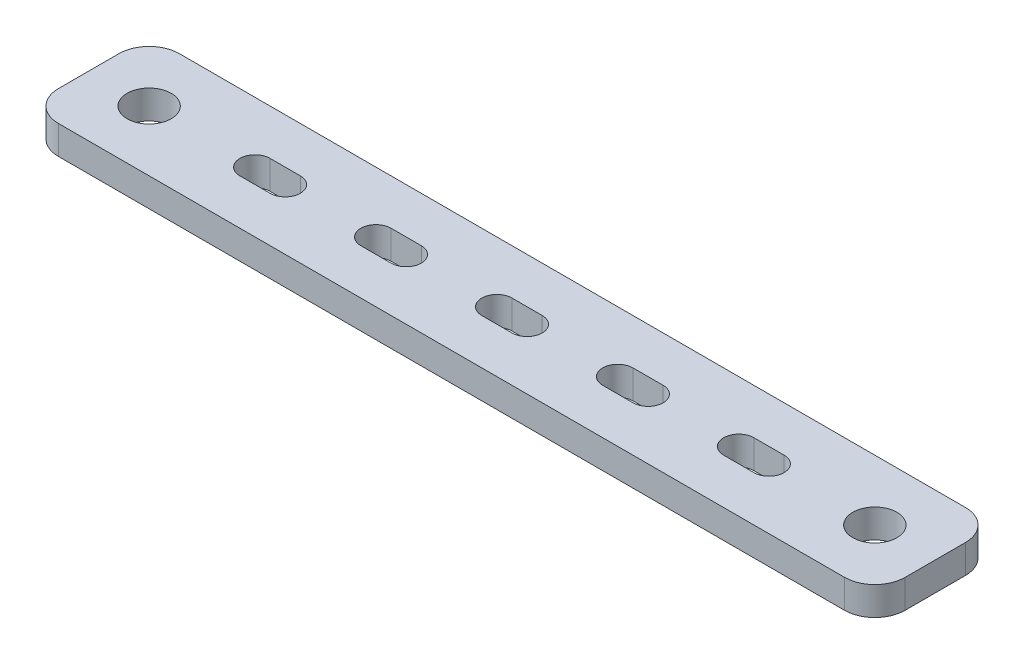
ISO-10303-21;
HEADER;
FILE_DESCRIPTION(('STEP AP214'),'2;1');
FILE_NAME('part.step','',(''),(''),'','','');
FILE_SCHEMA(('AUTOMOTIVE_DESIGN { 1 0 10303 214 1 1 1 1 }'));
ENDSEC;
DATA;
#1=APPLICATION_CONTEXT('core data for automotive mechanical design processes');
#2=APPLICATION_PROTOCOL_DEFINITION('international standard','automotive_design',2000,#1);
#3=PRODUCT_CONTEXT('',#1,'mechanical');
#4=PRODUCT('Part','Part','',(#3));
#5=PRODUCT_RELATED_PRODUCT_CATEGORY('part','',(#4));
#6=PRODUCT_DEFINITION_FORMATION('','',#4);
#7=PRODUCT_DEFINITION_CONTEXT('part definition',#1,'design');
#8=PRODUCT_DEFINITION('design','',#6,#7);
#9=PRODUCT_DEFINITION_SHAPE('','',#8);
#10=(LENGTH_UNIT() NAMED_UNIT(*) SI_UNIT(.MILLI.,.METRE.));
#11=(NAMED_UNIT(*) PLANE_ANGLE_UNIT() SI_UNIT($,.RADIAN.));
#12=(NAMED_UNIT(*) SI_UNIT($,.STERADIAN.) SOLID_ANGLE_UNIT());
#13=UNCERTAINTY_MEASURE_WITH_UNIT(LENGTH_MEASURE(1.E-05),#10,'distance_accuracy_value','');
#14=(GEOMETRIC_REPRESENTATION_CONTEXT(3) GLOBAL_UNCERTAINTY_ASSIGNED_CONTEXT((#13)) GLOBAL_UNIT_ASSIGNED_CONTEXT((#10,
#11,#12)) REPRESENTATION_CONTEXT('',''));
#15=CARTESIAN_POINT('',(0.,0.,0.));
#16=DIRECTION('',(0.,0.,1.));
#17=DIRECTION('',(1.,0.,0.));
#18=AXIS2_PLACEMENT_3D('',#15,#16,#17);
#19=CARTESIAN_POINT('',(-88.9,6.,12.7));
#20=DIRECTION('',(1.,0.,0.));
#21=DIRECTION('',(0.,0.,-1.));
#22=AXIS2_PLACEMENT_3D('',#19,#20,#21);
#23=PLANE('',#22);
#24=DIRECTION('',(0.,0.,1.));
#25=VECTOR('',#24,1.);
#26=CARTESIAN_POINT('',(-88.9,0.,12.7));
#27=LINE('',#26,#25);
#28=CARTESIAN_POINT('',(-88.9,0.,-6.34999999999999));
#29=VERTEX_POINT('',#28);
#30=CARTESIAN_POINT('',(-88.9,0.,6.35000000000001));
#31=VERTEX_POINT('',#30);
#32=EDGE_CURVE('E396',#29,#31,#27,.T.);
#33=ORIENTED_EDGE('',*,*,#32,.T.);
#34=DIRECTION('',(0.,-1.,0.));
#35=VECTOR('',#34,1.);
#36=CARTESIAN_POINT('',(-88.9,6.,6.35000000000001));
#37=LINE('',#36,#35);
#38=CARTESIAN_POINT('',(-88.9,6.,6.35000000000001));
#39=VERTEX_POINT('',#38);
#40=EDGE_CURVE('E11',#31,#39,#37,.F.);
#41=ORIENTED_EDGE('',*,*,#40,.T.);
#42=DIRECTION('',(0.,0.,1.));
#43=VECTOR('',#42,1.);
#44=CARTESIAN_POINT('',(-88.9,6.,12.7));
#45=LINE('',#44,#43);
#46=CARTESIAN_POINT('',(-88.9,6.,-6.34999999999999));
#47=VERTEX_POINT('',#46);
#48=EDGE_CURVE('E403',#47,#39,#45,.T.);
#49=ORIENTED_EDGE('',*,*,#48,.F.);
#50=DIRECTION('',(0.,-1.,0.));
#51=VECTOR('',#50,1.);
#52=CARTESIAN_POINT('',(-88.9,6.,-6.34999999999999));
#53=LINE('',#52,#51);
#54=EDGE_CURVE('E48',#47,#29,#53,.T.);
#55=ORIENTED_EDGE('',*,*,#54,.T.);
#56=EDGE_LOOP('',(#33,#41,#49,#55));
#57=FACE_BOUND('',#56,.T.);
#58=ADVANCED_FACE('F40',(#57),#23,.F.);
#59=CARTESIAN_POINT('',(88.9,6.,12.7));
#60=DIRECTION('',(0.,0.,-1.));
#61=DIRECTION('',(-1.,0.,0.));
#62=AXIS2_PLACEMENT_3D('',#59,#60,#61);
#63=PLANE('',#62);
#64=DIRECTION('',(1.,0.,0.));
#65=VECTOR('',#64,1.);
#66=CARTESIAN_POINT('',(88.9,0.,12.7));
#67=LINE('',#66,#65);
#68=CARTESIAN_POINT('',(-82.55,0.,12.7));
#69=VERTEX_POINT('',#68);
#70=CARTESIAN_POINT('',(82.55,0.,12.7));
#71=VERTEX_POINT('',#70);
#72=EDGE_CURVE('E418',#69,#71,#67,.T.);
#73=ORIENTED_EDGE('',*,*,#72,.T.);
#74=DIRECTION('',(0.,-1.,0.));
#75=VECTOR('',#74,1.);
#76=CARTESIAN_POINT('',(82.55,6.,12.7));
#77=LINE('',#76,#75);
#78=CARTESIAN_POINT('',(82.55,6.,12.7));
#79=VERTEX_POINT('',#78);
#80=EDGE_CURVE('E440',#71,#79,#77,.F.);
#81=ORIENTED_EDGE('',*,*,#80,.T.);
#82=DIRECTION('',(1.,0.,0.));
#83=VECTOR('',#82,1.);
#84=CARTESIAN_POINT('',(88.9,6.,12.7));
#85=LINE('',#84,#83);
#86=CARTESIAN_POINT('',(-82.55,6.,12.7));
#87=VERTEX_POINT('',#86);
#88=EDGE_CURVE('E406',#87,#79,#85,.T.);
#89=ORIENTED_EDGE('',*,*,#88,.F.);
#90=DIRECTION('',(0.,-1.,0.));
#91=VECTOR('',#90,1.);
#92=CARTESIAN_POINT('',(-82.55,6.,12.7));
#93=LINE('',#92,#91);
#94=EDGE_CURVE('E437',#87,#69,#93,.T.);
#95=ORIENTED_EDGE('',*,*,#94,.T.);
#96=EDGE_LOOP('',(#73,#81,#89,#95));
#97=FACE_BOUND('',#96,.T.);
#98=ADVANCED_FACE('F473',(#97),#63,.F.);
#99=CARTESIAN_POINT('',(88.9,6.,12.7));
#100=DIRECTION('',(-1.,0.,0.));
#101=DIRECTION('',(0.,0.,1.));
#102=AXIS2_PLACEMENT_3D('',#99,#100,#101);
#103=PLANE('',#102);
#104=DIRECTION('',(0.,0.,-1.));
#105=VECTOR('',#104,1.);
#106=CARTESIAN_POINT('',(88.9,6.,12.7));
#107=LINE('',#106,#105);
#108=CARTESIAN_POINT('',(88.9,6.,6.34999999999999));
#109=VERTEX_POINT('',#108);
#110=CARTESIAN_POINT('',(88.9,6.,-6.35000000000001));
#111=VERTEX_POINT('',#110);
#112=EDGE_CURVE('E411',#109,#111,#107,.T.);
#113=ORIENTED_EDGE('',*,*,#112,.F.);
#114=DIRECTION('',(0.,-1.,0.));
#115=VECTOR('',#114,1.);
#116=CARTESIAN_POINT('',(88.9,6.,6.34999999999999));
#117=LINE('',#116,#115);
#118=CARTESIAN_POINT('',(88.9,0.,6.34999999999999));
#119=VERTEX_POINT('',#118);
#120=EDGE_CURVE('E426',#109,#119,#117,.T.);
#121=ORIENTED_EDGE('',*,*,#120,.T.);
#122=DIRECTION('',(0.,0.,-1.));
#123=VECTOR('',#122,1.);
#124=CARTESIAN_POINT('',(88.9,0.,12.7));
#125=LINE('',#124,#123);
#126=CARTESIAN_POINT('',(88.9,0.,-6.35000000000001));
#127=VERTEX_POINT('',#126);
#128=EDGE_CURVE('E421',#119,#127,#125,.T.);
#129=ORIENTED_EDGE('',*,*,#128,.T.);
#130=DIRECTION('',(0.,-1.,0.));
#131=VECTOR('',#130,1.);
#132=CARTESIAN_POINT('',(88.9,6.,-6.35000000000001));
#133=LINE('',#132,#131);
#134=EDGE_CURVE('E415',#127,#111,#133,.F.);
#135=ORIENTED_EDGE('',*,*,#134,.T.);
#136=EDGE_LOOP('',(#113,#121,#129,#135));
#137=FACE_BOUND('',#136,.T.);
#138=ADVANCED_FACE('F481',(#137),#103,.F.);
#139=CARTESIAN_POINT('',(88.9,6.,-12.7));
#140=DIRECTION('',(0.,0.,1.));
#141=DIRECTION('',(1.,0.,0.));
#142=AXIS2_PLACEMENT_3D('',#139,#140,#141);
#143=PLANE('',#142);
#144=DIRECTION('',(-1.,0.,0.));
#145=VECTOR('',#144,1.);
#146=CARTESIAN_POINT('',(88.9,6.,-12.7));
#147=LINE('',#146,#145);
#148=CARTESIAN_POINT('',(82.55,6.,-12.7));
#149=VERTEX_POINT('',#148);
#150=CARTESIAN_POINT('',(-82.55,6.,-12.7));
#151=VERTEX_POINT('',#150);
#152=EDGE_CURVE('E413',#149,#151,#147,.T.);
#153=ORIENTED_EDGE('',*,*,#152,.F.);
#154=DIRECTION('',(0.,-1.,0.));
#155=VECTOR('',#154,1.);
#156=CARTESIAN_POINT('',(82.55,6.,-12.7));
#157=LINE('',#156,#155);
#158=CARTESIAN_POINT('',(82.55,0.,-12.7));
#159=VERTEX_POINT('',#158);
#160=EDGE_CURVE('E452',#149,#159,#157,.T.);
#161=ORIENTED_EDGE('',*,*,#160,.T.);
#162=DIRECTION('',(-1.,0.,0.));
#163=VECTOR('',#162,1.);
#164=CARTESIAN_POINT('',(88.9,0.,-12.7));
#165=LINE('',#164,#163);
#166=CARTESIAN_POINT('',(-82.55,0.,-12.7));
#167=VERTEX_POINT('',#166);
#168=EDGE_CURVE('E407',#159,#167,#165,.T.);
#169=ORIENTED_EDGE('',*,*,#168,.T.);
#170=DIRECTION('',(0.,-1.,0.));
#171=VECTOR('',#170,1.);
#172=CARTESIAN_POINT('',(-82.55,6.,-12.7));
#173=LINE('',#172,#171);
#174=EDGE_CURVE('E55',#167,#151,#173,.F.);
#175=ORIENTED_EDGE('',*,*,#174,.T.);
#176=EDGE_LOOP('',(#153,#161,#169,#175));
#177=FACE_BOUND('',#176,.T.);
#178=ADVANCED_FACE('F486',(#177),#143,.F.);
#179=CARTESIAN_POINT('',(0.,6.,0.));
#180=DIRECTION('',(0.,1.,0.));
#181=DIRECTION('',(0.,0.,1.));
#182=AXIS2_PLACEMENT_3D('',#179,#180,#181);
#183=PLANE('',#182);
#184=CARTESIAN_POINT('',(76.2,6.,0.));
#185=DIRECTION('',(0.,-1.,0.));
#186=DIRECTION('',(0.,0.,1.));
#187=AXIS2_PLACEMENT_3D('',#184,#185,#186);
#188=CIRCLE('',#187,4.6355);
#189=CARTESIAN_POINT('',(76.2,6.,4.6355));
#190=VERTEX_POINT('',#189);
#191=EDGE_CURVE('E835',#190,#190,#188,.T.);
#192=ORIENTED_EDGE('',*,*,#191,.T.);
#193=EDGE_LOOP('',(#192));
#194=FACE_BOUND('',#193,.T.);
#195=CARTESIAN_POINT('',(-76.2,6.,0.));
#196=DIRECTION('',(0.,1.,0.));
#197=DIRECTION('',(0.,0.,1.));
#198=AXIS2_PLACEMENT_3D('',#195,#196,#197);
#199=CIRCLE('',#198,4.6355);
#200=CARTESIAN_POINT('',(-76.2,6.,4.6355));
#201=VERTEX_POINT('',#200);
#202=EDGE_CURVE('E258',#201,#201,#199,.T.);
#203=ORIENTED_EDGE('',*,*,#202,.F.);
#204=EDGE_LOOP('',(#203));
#205=FACE_BOUND('',#204,.T.);
#206=CARTESIAN_POINT('',(47.625,6.,2.19974406760813E-13));
#207=DIRECTION('',(0.,-1.,0.));
#208=DIRECTION('',(0.,0.,-1.));
#209=AXIS2_PLACEMENT_3D('',#206,#207,#208);
#210=CIRCLE('',#209,3.175);
#211=CARTESIAN_POINT('',(47.625,6.,3.17500000000022));
#212=VERTEX_POINT('',#211);
#213=CARTESIAN_POINT('',(47.625,6.,-3.17499999999978));
#214=VERTEX_POINT('',#213);
#215=EDGE_CURVE('E231',#212,#214,#210,.T.);
#216=ORIENTED_EDGE('',*,*,#215,.T.);
#217=DIRECTION('',(1.,0.,0.));
#218=VECTOR('',#217,1.);
#219=CARTESIAN_POINT('',(47.625,6.,-3.17499999999978));
#220=LINE('',#219,#218);
#221=CARTESIAN_POINT('',(53.975,6.,-3.17499999999978));
#222=VERTEX_POINT('',#221);
#223=EDGE_CURVE('E243',#214,#222,#220,.T.);
#224=ORIENTED_EDGE('',*,*,#223,.T.);
#225=CARTESIAN_POINT('',(53.975,6.,2.20995564643358E-13));
#226=DIRECTION('',(0.,-1.,0.));
#227=DIRECTION('',(0.,0.,-1.));
#228=AXIS2_PLACEMENT_3D('',#225,#226,#227);
#229=CIRCLE('',#228,3.175);
#230=CARTESIAN_POINT('',(53.975,6.,3.17500000000022));
#231=VERTEX_POINT('',#230);
#232=EDGE_CURVE('E247',#222,#231,#229,.T.);
#233=ORIENTED_EDGE('',*,*,#232,.T.);
#234=DIRECTION('',(-1.,0.,0.));
#235=VECTOR('',#234,1.);
#236=CARTESIAN_POINT('',(47.625,6.,3.17500000000022));
#237=LINE('',#236,#235);
#238=EDGE_CURVE('E239',#231,#212,#237,.T.);
#239=ORIENTED_EDGE('',*,*,#238,.T.);
#240=EDGE_LOOP('',(#216,#224,#233,#239));
#241=FACE_BOUND('',#240,.T.);
#242=CARTESIAN_POINT('',(22.225,6.,2.19974406760813E-13));
#243=DIRECTION('',(0.,-1.,0.));
#244=DIRECTION('',(0.,0.,-1.));
#245=AXIS2_PLACEMENT_3D('',#242,#243,#244);
#246=CIRCLE('',#245,3.175);
#247=CARTESIAN_POINT('',(22.225,6.,3.17500000000022));
#248=VERTEX_POINT('',#247);
#249=CARTESIAN_POINT('',(22.225,6.,-3.17499999999978));
#250=VERTEX_POINT('',#249);
#251=EDGE_CURVE('E275',#248,#250,#246,.T.);
#252=ORIENTED_EDGE('',*,*,#251,.T.);
#253=DIRECTION('',(1.,0.,0.));
#254=VECTOR('',#253,1.);
#255=CARTESIAN_POINT('',(22.225,6.,-3.17499999999978));
#256=LINE('',#255,#254);
#257=CARTESIAN_POINT('',(28.575,6.,-3.17499999999978));
#258=VERTEX_POINT('',#257);
#259=EDGE_CURVE('E278',#250,#258,#256,.T.);
#260=ORIENTED_EDGE('',*,*,#259,.T.);
#261=CARTESIAN_POINT('',(28.575,6.,2.20995564643358E-13));
#262=DIRECTION('',(0.,-1.,0.));
#263=DIRECTION('',(0.,0.,-1.));
#264=AXIS2_PLACEMENT_3D('',#261,#262,#263);
#265=CIRCLE('',#264,3.175);
#266=CARTESIAN_POINT('',(28.575,6.,3.17500000000022));
#267=VERTEX_POINT('',#266);
#268=EDGE_CURVE('E282',#258,#267,#265,.T.);
#269=ORIENTED_EDGE('',*,*,#268,.T.);
#270=DIRECTION('',(-1.,0.,0.));
#271=VECTOR('',#270,1.);
#272=CARTESIAN_POINT('',(22.225,6.,3.17500000000022));
#273=LINE('',#272,#271);
#274=EDGE_CURVE('E285',#267,#248,#273,.T.);
#275=ORIENTED_EDGE('',*,*,#274,.T.);
#276=EDGE_LOOP('',(#252,#260,#269,#275));
#277=FACE_BOUND('',#276,.T.);
#278=CARTESIAN_POINT('',(-3.17499999999998,6.,2.19974406760813E-13));
#279=DIRECTION('',(0.,-1.,0.));
#280=DIRECTION('',(0.,0.,-1.));
#281=AXIS2_PLACEMENT_3D('',#278,#279,#280);
#282=CIRCLE('',#281,3.175);
#283=CARTESIAN_POINT('',(-3.17499999999998,6.,3.17500000000022));
#284=VERTEX_POINT('',#283);
#285=CARTESIAN_POINT('',(-3.17499999999998,6.,-3.17499999999978));
#286=VERTEX_POINT('',#285);
#287=EDGE_CURVE('E307',#284,#286,#282,.T.);
#288=ORIENTED_EDGE('',*,*,#287,.T.);
#289=DIRECTION('',(1.,0.,0.));
#290=VECTOR('',#289,1.);
#291=CARTESIAN_POINT('',(-3.17499999999998,6.,-3.17499999999978));
#292=LINE('',#291,#290);
#293=CARTESIAN_POINT('',(3.17500000000002,6.,-3.17499999999978));
#294=VERTEX_POINT('',#293);
#295=EDGE_CURVE('E310',#286,#294,#292,.T.);
#296=ORIENTED_EDGE('',*,*,#295,.T.);
#297=CARTESIAN_POINT('',(3.17500000000003,6.,2.20995564643358E-13));
#298=DIRECTION('',(0.,-1.,0.));
#299=DIRECTION('',(0.,0.,-1.));
#300=AXIS2_PLACEMENT_3D('',#297,#298,#299);
#301=CIRCLE('',#300,3.175);
#302=CARTESIAN_POINT('',(3.17500000000002,6.,3.17500000000022));
#303=VERTEX_POINT('',#302);
#304=EDGE_CURVE('E314',#294,#303,#301,.T.);
#305=ORIENTED_EDGE('',*,*,#304,.T.);
#306=DIRECTION('',(-1.,0.,0.));
#307=VECTOR('',#306,1.);
#308=CARTESIAN_POINT('',(-3.17499999999998,6.,3.17500000000022));
#309=LINE('',#308,#307);
#310=EDGE_CURVE('E317',#303,#284,#309,.T.);
#311=ORIENTED_EDGE('',*,*,#310,.T.);
#312=EDGE_LOOP('',(#288,#296,#305,#311));
#313=FACE_BOUND('',#312,.T.);
#314=CARTESIAN_POINT('',(-28.575,6.,2.19974406760813E-13));
#315=DIRECTION('',(0.,-1.,0.));
#316=DIRECTION('',(0.,0.,-1.));
#317=AXIS2_PLACEMENT_3D('',#314,#315,#316);
#318=CIRCLE('',#317,3.175);
#319=CARTESIAN_POINT('',(-28.575,6.,3.17500000000022));
#320=VERTEX_POINT('',#319);
#321=CARTESIAN_POINT('',(-28.575,6.,-3.17499999999978));
#322=VERTEX_POINT('',#321);
#323=EDGE_CURVE('E339',#320,#322,#318,.T.);
#324=ORIENTED_EDGE('',*,*,#323,.T.);
#325=DIRECTION('',(1.,0.,0.));
#326=VECTOR('',#325,1.);
#327=CARTESIAN_POINT('',(-28.575,6.,-3.17499999999978));
#328=LINE('',#327,#326);
#329=CARTESIAN_POINT('',(-22.225,6.,-3.17499999999978));
#330=VERTEX_POINT('',#329);
#331=EDGE_CURVE('E342',#322,#330,#328,.T.);
#332=ORIENTED_EDGE('',*,*,#331,.T.);
#333=CARTESIAN_POINT('',(-22.225,6.,2.20995564643358E-13));
#334=DIRECTION('',(0.,-1.,0.));
#335=DIRECTION('',(0.,0.,-1.));
#336=AXIS2_PLACEMENT_3D('',#333,#334,#335);
#337=CIRCLE('',#336,3.175);
#338=CARTESIAN_POINT('',(-22.225,6.,3.17500000000022));
#339=VERTEX_POINT('',#338);
#340=EDGE_CURVE('E346',#330,#339,#337,.T.);
#341=ORIENTED_EDGE('',*,*,#340,.T.);
#342=DIRECTION('',(-1.,0.,0.));
#343=VECTOR('',#342,1.);
#344=CARTESIAN_POINT('',(-28.575,6.,3.17500000000022));
#345=LINE('',#344,#343);
#346=EDGE_CURVE('E349',#339,#320,#345,.T.);
#347=ORIENTED_EDGE('',*,*,#346,.T.);
#348=EDGE_LOOP('',(#324,#332,#341,#347));
#349=FACE_BOUND('',#348,.T.);
#350=CARTESIAN_POINT('',(-53.975,6.,2.19974406760813E-13));
#351=DIRECTION('',(0.,-1.,0.));
#352=DIRECTION('',(0.,0.,-1.));
#353=AXIS2_PLACEMENT_3D('',#350,#351,#352);
#354=CIRCLE('',#353,3.175);
#355=CARTESIAN_POINT('',(-53.975,6.,3.17500000000022));
#356=VERTEX_POINT('',#355);
#357=CARTESIAN_POINT('',(-53.975,6.,-3.17499999999978));
#358=VERTEX_POINT('',#357);
#359=EDGE_CURVE('E371',#356,#358,#354,.T.);
#360=ORIENTED_EDGE('',*,*,#359,.T.);
#361=DIRECTION('',(1.,0.,0.));
#362=VECTOR('',#361,1.);
#363=CARTESIAN_POINT('',(-53.975,6.,-3.17499999999978));
#364=LINE('',#363,#362);
#365=CARTESIAN_POINT('',(-47.625,6.,-3.17499999999978));
#366=VERTEX_POINT('',#365);
#367=EDGE_CURVE('E374',#358,#366,#364,.T.);
#368=ORIENTED_EDGE('',*,*,#367,.T.);
#369=CARTESIAN_POINT('',(-47.625,6.,2.20995564643358E-13));
#370=DIRECTION('',(0.,-1.,0.));
#371=DIRECTION('',(0.,0.,-1.));
#372=AXIS2_PLACEMENT_3D('',#369,#370,#371);
#373=CIRCLE('',#372,3.175);
#374=CARTESIAN_POINT('',(-47.625,6.,3.17500000000022));
#375=VERTEX_POINT('',#374);
#376=EDGE_CURVE('E378',#366,#375,#373,.T.);
#377=ORIENTED_EDGE('',*,*,#376,.T.);
#378=DIRECTION('',(-1.,0.,0.));
#379=VECTOR('',#378,1.);
#380=CARTESIAN_POINT('',(-53.975,6.,3.17500000000022));
#381=LINE('',#380,#379);
#382=EDGE_CURVE('E381',#375,#356,#381,.T.);
#383=ORIENTED_EDGE('',*,*,#382,.T.);
#384=EDGE_LOOP('',(#360,#368,#377,#383));
#385=FACE_BOUND('',#384,.T.);
#386=ORIENTED_EDGE('',*,*,#88,.T.);
#387=CARTESIAN_POINT('',(82.55,6.,6.34999999999999));
#388=DIRECTION('',(0.,1.,0.));
#389=DIRECTION('',(0.,0.,1.));
#390=AXIS2_PLACEMENT_3D('',#387,#388,#389);
#391=CIRCLE('',#390,6.35);
#392=EDGE_CURVE('E448',#79,#109,#391,.T.);
#393=ORIENTED_EDGE('',*,*,#392,.T.);
#394=ORIENTED_EDGE('',*,*,#112,.T.);
#395=CARTESIAN_POINT('',(82.55,6.,-6.35000000000001));
#396=DIRECTION('',(0.,1.,0.));
#397=DIRECTION('',(0.,0.,1.));
#398=AXIS2_PLACEMENT_3D('',#395,#396,#397);
#399=CIRCLE('',#398,6.35);
#400=EDGE_CURVE('E62',#111,#149,#399,.T.);
#401=ORIENTED_EDGE('',*,*,#400,.T.);
#402=ORIENTED_EDGE('',*,*,#152,.T.);
#403=CARTESIAN_POINT('',(-82.55,6.,-6.34999999999999));
#404=DIRECTION('',(0.,1.,0.));
#405=DIRECTION('',(0.,0.,1.));
#406=AXIS2_PLACEMENT_3D('',#403,#404,#405);
#407=CIRCLE('',#406,6.35);
#408=EDGE_CURVE('E443',#151,#47,#407,.T.);
#409=ORIENTED_EDGE('',*,*,#408,.T.);
#410=ORIENTED_EDGE('',*,*,#48,.T.);
#411=CARTESIAN_POINT('',(-82.55,6.,6.35000000000001));
#412=DIRECTION('',(0.,1.,0.));
#413=DIRECTION('',(0.,0.,1.));
#414=AXIS2_PLACEMENT_3D('',#411,#412,#413);
#415=CIRCLE('',#414,6.35);
#416=EDGE_CURVE('E445',#39,#87,#415,.T.);
#417=ORIENTED_EDGE('',*,*,#416,.T.);
#418=EDGE_LOOP('',(#386,#393,#394,#401,#402,#409,#410,#417));
#419=FACE_BOUND('',#418,.T.);
#420=ADVANCED_FACE('F249',(#194,#205,#241,#277,#313,#349,#385,#419),#183,.T.);
#421=CARTESIAN_POINT('',(0.,0.,0.));
#422=DIRECTION('',(0.,1.,0.));
#423=DIRECTION('',(0.,0.,1.));
#424=AXIS2_PLACEMENT_3D('',#421,#422,#423);
#425=PLANE('',#424);
#426=CARTESIAN_POINT('',(76.2,0.,0.));
#427=DIRECTION('',(0.,-1.,0.));
#428=DIRECTION('',(0.,0.,1.));
#429=AXIS2_PLACEMENT_3D('',#426,#427,#428);
#430=CIRCLE('',#429,4.6355);
#431=CARTESIAN_POINT('',(76.2,0.,4.6355));
#432=VERTEX_POINT('',#431);
#433=EDGE_CURVE('E832',#432,#432,#430,.T.);
#434=ORIENTED_EDGE('',*,*,#433,.F.);
#435=EDGE_LOOP('',(#434));
#436=FACE_BOUND('',#435,.T.);
#437=CARTESIAN_POINT('',(-76.2,0.,0.));
#438=DIRECTION('',(0.,1.,0.));
#439=DIRECTION('',(0.,0.,1.));
#440=AXIS2_PLACEMENT_3D('',#437,#438,#439);
#441=CIRCLE('',#440,4.6355);
#442=CARTESIAN_POINT('',(-76.2,0.,4.6355));
#443=VERTEX_POINT('',#442);
#444=EDGE_CURVE('E265',#443,#443,#441,.T.);
#445=ORIENTED_EDGE('',*,*,#444,.T.);
#446=EDGE_LOOP('',(#445));
#447=FACE_BOUND('',#446,.T.);
#448=DIRECTION('',(1.,0.,0.));
#449=VECTOR('',#448,1.);
#450=CARTESIAN_POINT('',(47.625,0.,-3.17499999999978));
#451=LINE('',#450,#449);
#452=CARTESIAN_POINT('',(47.625,0.,-3.17499999999978));
#453=VERTEX_POINT('',#452);
#454=CARTESIAN_POINT('',(53.975,0.,-3.17499999999978));
#455=VERTEX_POINT('',#454);
#456=EDGE_CURVE('E264',#453,#455,#451,.T.);
#457=ORIENTED_EDGE('',*,*,#456,.F.);
#458=CARTESIAN_POINT('',(47.625,0.,2.19974406760813E-13));
#459=DIRECTION('',(0.,-1.,0.));
#460=DIRECTION('',(0.,0.,-1.));
#461=AXIS2_PLACEMENT_3D('',#458,#459,#460);
#462=CIRCLE('',#461,3.175);
#463=CARTESIAN_POINT('',(47.625,0.,3.17500000000022));
#464=VERTEX_POINT('',#463);
#465=EDGE_CURVE('E234',#464,#453,#462,.T.);
#466=ORIENTED_EDGE('',*,*,#465,.F.);
#467=DIRECTION('',(-1.,0.,0.));
#468=VECTOR('',#467,1.);
#469=CARTESIAN_POINT('',(47.625,0.,3.17500000000022));
#470=LINE('',#469,#468);
#471=CARTESIAN_POINT('',(53.975,0.,3.17500000000022));
#472=VERTEX_POINT('',#471);
#473=EDGE_CURVE('E252',#472,#464,#470,.T.);
#474=ORIENTED_EDGE('',*,*,#473,.F.);
#475=CARTESIAN_POINT('',(53.975,0.,2.20995564643358E-13));
#476=DIRECTION('',(0.,-1.,0.));
#477=DIRECTION('',(0.,0.,-1.));
#478=AXIS2_PLACEMENT_3D('',#475,#476,#477);
#479=CIRCLE('',#478,3.175);
#480=EDGE_CURVE('E255',#455,#472,#479,.T.);
#481=ORIENTED_EDGE('',*,*,#480,.F.);
#482=EDGE_LOOP('',(#457,#466,#474,#481));
#483=FACE_BOUND('',#482,.T.);
#484=DIRECTION('',(1.,0.,0.));
#485=VECTOR('',#484,1.);
#486=CARTESIAN_POINT('',(22.225,0.,-3.17499999999978));
#487=LINE('',#486,#485);
#488=CARTESIAN_POINT('',(22.225,0.,-3.17499999999978));
#489=VERTEX_POINT('',#488);
#490=CARTESIAN_POINT('',(28.575,0.,-3.17499999999978));
#491=VERTEX_POINT('',#490);
#492=EDGE_CURVE('E290',#489,#491,#487,.T.);
#493=ORIENTED_EDGE('',*,*,#492,.F.);
#494=CARTESIAN_POINT('',(22.225,0.,2.19974406760813E-13));
#495=DIRECTION('',(0.,-1.,0.));
#496=DIRECTION('',(0.,0.,-1.));
#497=AXIS2_PLACEMENT_3D('',#494,#495,#496);
#498=CIRCLE('',#497,3.175);
#499=CARTESIAN_POINT('',(22.225,0.,3.17500000000022));
#500=VERTEX_POINT('',#499);
#501=EDGE_CURVE('E271',#500,#489,#498,.T.);
#502=ORIENTED_EDGE('',*,*,#501,.F.);
#503=DIRECTION('',(-1.,0.,0.));
#504=VECTOR('',#503,1.);
#505=CARTESIAN_POINT('',(22.225,0.,3.17500000000022));
#506=LINE('',#505,#504);
#507=CARTESIAN_POINT('',(28.575,0.,3.17500000000022));
#508=VERTEX_POINT('',#507);
#509=EDGE_CURVE('E279',#508,#500,#506,.T.);
#510=ORIENTED_EDGE('',*,*,#509,.F.);
#511=CARTESIAN_POINT('',(28.575,0.,2.20995564643358E-13));
#512=DIRECTION('',(0.,-1.,0.));
#513=DIRECTION('',(0.,0.,-1.));
#514=AXIS2_PLACEMENT_3D('',#511,#512,#513);
#515=CIRCLE('',#514,3.175);
#516=EDGE_CURVE('E293',#491,#508,#515,.T.);
#517=ORIENTED_EDGE('',*,*,#516,.F.);
#518=EDGE_LOOP('',(#493,#502,#510,#517));
#519=FACE_BOUND('',#518,.T.);
#520=DIRECTION('',(1.,0.,0.));
#521=VECTOR('',#520,1.);
#522=CARTESIAN_POINT('',(-3.17499999999998,0.,-3.17499999999978));
#523=LINE('',#522,#521);
#524=CARTESIAN_POINT('',(-3.17499999999998,0.,-3.17499999999978));
#525=VERTEX_POINT('',#524);
#526=CARTESIAN_POINT('',(3.17500000000002,0.,-3.17499999999978));
#527=VERTEX_POINT('',#526);
#528=EDGE_CURVE('E322',#525,#527,#523,.T.);
#529=ORIENTED_EDGE('',*,*,#528,.F.);
#530=CARTESIAN_POINT('',(-3.17499999999998,0.,2.19974406760813E-13));
#531=DIRECTION('',(0.,-1.,0.));
#532=DIRECTION('',(0.,0.,-1.));
#533=AXIS2_PLACEMENT_3D('',#530,#531,#532);
#534=CIRCLE('',#533,3.175);
#535=CARTESIAN_POINT('',(-3.17499999999998,0.,3.17500000000022));
#536=VERTEX_POINT('',#535);
#537=EDGE_CURVE('E300',#536,#525,#534,.T.);
#538=ORIENTED_EDGE('',*,*,#537,.F.);
#539=DIRECTION('',(-1.,0.,0.));
#540=VECTOR('',#539,1.);
#541=CARTESIAN_POINT('',(-3.17499999999998,0.,3.17500000000022));
#542=LINE('',#541,#540);
#543=CARTESIAN_POINT('',(3.17500000000002,0.,3.17500000000022));
#544=VERTEX_POINT('',#543);
#545=EDGE_CURVE('E311',#544,#536,#542,.T.);
#546=ORIENTED_EDGE('',*,*,#545,.F.);
#547=CARTESIAN_POINT('',(3.17500000000003,0.,2.20995564643358E-13));
#548=DIRECTION('',(0.,-1.,0.));
#549=DIRECTION('',(0.,0.,-1.));
#550=AXIS2_PLACEMENT_3D('',#547,#548,#549);
#551=CIRCLE('',#550,3.175);
#552=EDGE_CURVE('E325',#527,#544,#551,.T.);
#553=ORIENTED_EDGE('',*,*,#552,.F.);
#554=EDGE_LOOP('',(#529,#538,#546,#553));
#555=FACE_BOUND('',#554,.T.);
#556=DIRECTION('',(1.,0.,0.));
#557=VECTOR('',#556,1.);
#558=CARTESIAN_POINT('',(-28.575,0.,-3.17499999999978));
#559=LINE('',#558,#557);
#560=CARTESIAN_POINT('',(-28.575,0.,-3.17499999999978));
#561=VERTEX_POINT('',#560);
#562=CARTESIAN_POINT('',(-22.225,0.,-3.17499999999978));
#563=VERTEX_POINT('',#562);
#564=EDGE_CURVE('E354',#561,#563,#559,.T.);
#565=ORIENTED_EDGE('',*,*,#564,.F.);
#566=CARTESIAN_POINT('',(-28.575,0.,2.19974406760813E-13));
#567=DIRECTION('',(0.,-1.,0.));
#568=DIRECTION('',(0.,0.,-1.));
#569=AXIS2_PLACEMENT_3D('',#566,#567,#568);
#570=CIRCLE('',#569,3.175);
#571=CARTESIAN_POINT('',(-28.575,0.,3.17500000000022));
#572=VERTEX_POINT('',#571);
#573=EDGE_CURVE('E332',#572,#561,#570,.T.);
#574=ORIENTED_EDGE('',*,*,#573,.F.);
#575=DIRECTION('',(-1.,0.,0.));
#576=VECTOR('',#575,1.);
#577=CARTESIAN_POINT('',(-28.575,0.,3.17500000000022));
#578=LINE('',#577,#576);
#579=CARTESIAN_POINT('',(-22.225,0.,3.17500000000022));
#580=VERTEX_POINT('',#579);
#581=EDGE_CURVE('E343',#580,#572,#578,.T.);
#582=ORIENTED_EDGE('',*,*,#581,.F.);
#583=CARTESIAN_POINT('',(-22.225,0.,2.20995564643358E-13));
#584=DIRECTION('',(0.,-1.,0.));
#585=DIRECTION('',(0.,0.,-1.));
#586=AXIS2_PLACEMENT_3D('',#583,#584,#585);
#587=CIRCLE('',#586,3.175);
#588=EDGE_CURVE('E357',#563,#580,#587,.T.);
#589=ORIENTED_EDGE('',*,*,#588,.F.);
#590=EDGE_LOOP('',(#565,#574,#582,#589));
#591=FACE_BOUND('',#590,.T.);
#592=DIRECTION('',(1.,0.,0.));
#593=VECTOR('',#592,1.);
#594=CARTESIAN_POINT('',(-53.975,0.,-3.17499999999978));
#595=LINE('',#594,#593);
#596=CARTESIAN_POINT('',(-53.975,0.,-3.17499999999978));
#597=VERTEX_POINT('',#596);
#598=CARTESIAN_POINT('',(-47.625,0.,-3.17499999999978));
#599=VERTEX_POINT('',#598);
#600=EDGE_CURVE('E386',#597,#599,#595,.T.);
#601=ORIENTED_EDGE('',*,*,#600,.F.);
#602=CARTESIAN_POINT('',(-53.975,0.,2.19974406760813E-13));
#603=DIRECTION('',(0.,-1.,0.));
#604=DIRECTION('',(0.,0.,-1.));
#605=AXIS2_PLACEMENT_3D('',#602,#603,#604);
#606=CIRCLE('',#605,3.175);
#607=CARTESIAN_POINT('',(-53.975,0.,3.17500000000022));
#608=VERTEX_POINT('',#607);
#609=EDGE_CURVE('E364',#608,#597,#606,.T.);
#610=ORIENTED_EDGE('',*,*,#609,.F.);
#611=DIRECTION('',(-1.,0.,0.));
#612=VECTOR('',#611,1.);
#613=CARTESIAN_POINT('',(-53.975,0.,3.17500000000022));
#614=LINE('',#613,#612);
#615=CARTESIAN_POINT('',(-47.625,0.,3.17500000000022));
#616=VERTEX_POINT('',#615);
#617=EDGE_CURVE('E375',#616,#608,#614,.T.);
#618=ORIENTED_EDGE('',*,*,#617,.F.);
#619=CARTESIAN_POINT('',(-47.625,0.,2.20995564643358E-13));
#620=DIRECTION('',(0.,-1.,0.));
#621=DIRECTION('',(0.,0.,-1.));
#622=AXIS2_PLACEMENT_3D('',#619,#620,#621);
#623=CIRCLE('',#622,3.175);
#624=EDGE_CURVE('E389',#599,#616,#623,.T.);
#625=ORIENTED_EDGE('',*,*,#624,.F.);
#626=EDGE_LOOP('',(#601,#610,#618,#625));
#627=FACE_BOUND('',#626,.T.);
#628=ORIENTED_EDGE('',*,*,#128,.F.);
#629=CARTESIAN_POINT('',(82.55,0.,6.34999999999999));
#630=DIRECTION('',(0.,1.,0.));
#631=DIRECTION('',(0.,0.,1.));
#632=AXIS2_PLACEMENT_3D('',#629,#630,#631);
#633=CIRCLE('',#632,6.35);
#634=EDGE_CURVE('E435',#119,#71,#633,.F.);
#635=ORIENTED_EDGE('',*,*,#634,.T.);
#636=ORIENTED_EDGE('',*,*,#72,.F.);
#637=CARTESIAN_POINT('',(-82.55,0.,6.35000000000001));
#638=DIRECTION('',(0.,1.,0.));
#639=DIRECTION('',(0.,0.,1.));
#640=AXIS2_PLACEMENT_3D('',#637,#638,#639);
#641=CIRCLE('',#640,6.35);
#642=EDGE_CURVE('E431',#69,#31,#641,.F.);
#643=ORIENTED_EDGE('',*,*,#642,.T.);
#644=ORIENTED_EDGE('',*,*,#32,.F.);
#645=CARTESIAN_POINT('',(-82.55,0.,-6.34999999999999));
#646=DIRECTION('',(0.,1.,0.));
#647=DIRECTION('',(0.,0.,1.));
#648=AXIS2_PLACEMENT_3D('',#645,#646,#647);
#649=CIRCLE('',#648,6.35);
#650=EDGE_CURVE('E429',#29,#167,#649,.F.);
#651=ORIENTED_EDGE('',*,*,#650,.T.);
#652=ORIENTED_EDGE('',*,*,#168,.F.);
#653=CARTESIAN_POINT('',(82.55,0.,-6.35000000000001));
#654=DIRECTION('',(0.,1.,0.));
#655=DIRECTION('',(0.,0.,1.));
#656=AXIS2_PLACEMENT_3D('',#653,#654,#655);
#657=CIRCLE('',#656,6.35);
#658=EDGE_CURVE('E433',#159,#127,#657,.F.);
#659=ORIENTED_EDGE('',*,*,#658,.T.);
#660=EDGE_LOOP('',(#628,#635,#636,#643,#644,#651,#652,#659));
#661=FACE_BOUND('',#660,.T.);
#662=ADVANCED_FACE('F464',(#436,#447,#483,#519,#555,#591,#627,#661),#425,.F.);
#663=CARTESIAN_POINT('',(-53.975,6.,2.19974406760813E-13));
#664=DIRECTION('',(0.,-1.,0.));
#665=DIRECTION('',(0.,0.,-1.));
#666=AXIS2_PLACEMENT_3D('',#663,#664,#665);
#667=CYLINDRICAL_SURFACE('',#666,3.175);
#668=ORIENTED_EDGE('',*,*,#609,.T.);
#669=DIRECTION('',(0.,-1.,0.));
#670=VECTOR('',#669,1.);
#671=CARTESIAN_POINT('',(-53.975,6.,-3.17499999999978));
#672=LINE('',#671,#670);
#673=EDGE_CURVE('E384',#358,#597,#672,.T.);
#674=ORIENTED_EDGE('',*,*,#673,.F.);
#675=ORIENTED_EDGE('',*,*,#359,.F.);
#676=DIRECTION('',(0.,-1.,0.));
#677=VECTOR('',#676,1.);
#678=CARTESIAN_POINT('',(-53.975,6.,3.17500000000022));
#679=LINE('',#678,#677);
#680=EDGE_CURVE('E394',#356,#608,#679,.T.);
#681=ORIENTED_EDGE('',*,*,#680,.T.);
#682=EDGE_LOOP('',(#668,#674,#675,#681));
#683=FACE_BOUND('',#682,.T.);
#684=ADVANCED_FACE('F548',(#683),#667,.F.);
#685=CARTESIAN_POINT('',(-53.975,6.,3.17500000000022));
#686=DIRECTION('',(0.,0.,1.));
#687=DIRECTION('',(1.,0.,0.));
#688=AXIS2_PLACEMENT_3D('',#685,#686,#687);
#689=PLANE('',#688);
#690=ORIENTED_EDGE('',*,*,#617,.T.);
#691=ORIENTED_EDGE('',*,*,#680,.F.);
#692=ORIENTED_EDGE('',*,*,#382,.F.);
#693=DIRECTION('',(0.,-1.,0.));
#694=VECTOR('',#693,1.);
#695=CARTESIAN_POINT('',(-47.625,6.,3.17500000000022));
#696=LINE('',#695,#694);
#697=EDGE_CURVE('E397',#375,#616,#696,.T.);
#698=ORIENTED_EDGE('',*,*,#697,.T.);
#699=EDGE_LOOP('',(#690,#691,#692,#698));
#700=FACE_BOUND('',#699,.T.);
#701=ADVANCED_FACE('F624',(#700),#689,.F.);
#702=CARTESIAN_POINT('',(-47.625,6.,2.20995564643358E-13));
#703=DIRECTION('',(0.,-1.,0.));
#704=DIRECTION('',(0.,0.,-1.));
#705=AXIS2_PLACEMENT_3D('',#702,#703,#704);
#706=CYLINDRICAL_SURFACE('',#705,3.175);
#707=ORIENTED_EDGE('',*,*,#624,.T.);
#708=ORIENTED_EDGE('',*,*,#697,.F.);
#709=ORIENTED_EDGE('',*,*,#376,.F.);
#710=DIRECTION('',(0.,-1.,0.));
#711=VECTOR('',#710,1.);
#712=CARTESIAN_POINT('',(-47.625,6.,-3.17499999999978));
#713=LINE('',#712,#711);
#714=EDGE_CURVE('E399',#366,#599,#713,.T.);
#715=ORIENTED_EDGE('',*,*,#714,.T.);
#716=EDGE_LOOP('',(#707,#708,#709,#715));
#717=FACE_BOUND('',#716,.T.);
#718=ADVANCED_FACE('F627',(#717),#706,.F.);
#719=CARTESIAN_POINT('',(-53.975,6.,-3.17499999999978));
#720=DIRECTION('',(0.,0.,-1.));
#721=DIRECTION('',(-1.,0.,0.));
#722=AXIS2_PLACEMENT_3D('',#719,#720,#721);
#723=PLANE('',#722);
#724=ORIENTED_EDGE('',*,*,#600,.T.);
#725=ORIENTED_EDGE('',*,*,#714,.F.);
#726=ORIENTED_EDGE('',*,*,#367,.F.);
#727=ORIENTED_EDGE('',*,*,#673,.T.);
#728=EDGE_LOOP('',(#724,#725,#726,#727));
#729=FACE_BOUND('',#728,.T.);
#730=ADVANCED_FACE('F622',(#729),#723,.F.);
#731=CARTESIAN_POINT('',(-28.575,6.,2.19974406760813E-13));
#732=DIRECTION('',(0.,-1.,0.));
#733=DIRECTION('',(0.,0.,-1.));
#734=AXIS2_PLACEMENT_3D('',#731,#732,#733);
#735=CYLINDRICAL_SURFACE('',#734,3.175);
#736=ORIENTED_EDGE('',*,*,#573,.T.);
#737=DIRECTION('',(0.,-1.,0.));
#738=VECTOR('',#737,1.);
#739=CARTESIAN_POINT('',(-28.575,6.,-3.17499999999978));
#740=LINE('',#739,#738);
#741=EDGE_CURVE('E352',#322,#561,#740,.T.);
#742=ORIENTED_EDGE('',*,*,#741,.F.);
#743=ORIENTED_EDGE('',*,*,#323,.F.);
#744=DIRECTION('',(0.,-1.,0.));
#745=VECTOR('',#744,1.);
#746=CARTESIAN_POINT('',(-28.575,6.,3.17500000000022));
#747=LINE('',#746,#745);
#748=EDGE_CURVE('E362',#320,#572,#747,.T.);
#749=ORIENTED_EDGE('',*,*,#748,.T.);
#750=EDGE_LOOP('',(#736,#742,#743,#749));
#751=FACE_BOUND('',#750,.T.);
#752=ADVANCED_FACE('F612',(#751),#735,.F.);
#753=CARTESIAN_POINT('',(-28.575,6.,3.17500000000022));
#754=DIRECTION('',(0.,0.,1.));
#755=DIRECTION('',(1.,0.,0.));
#756=AXIS2_PLACEMENT_3D('',#753,#754,#755);
#757=PLANE('',#756);
#758=ORIENTED_EDGE('',*,*,#581,.T.);
#759=ORIENTED_EDGE('',*,*,#748,.F.);
#760=ORIENTED_EDGE('',*,*,#346,.F.);
#761=DIRECTION('',(0.,-1.,0.));
#762=VECTOR('',#761,1.);
#763=CARTESIAN_POINT('',(-22.225,6.,3.17500000000022));
#764=LINE('',#763,#762);
#765=EDGE_CURVE('E365',#339,#580,#764,.T.);
#766=ORIENTED_EDGE('',*,*,#765,.T.);
#767=EDGE_LOOP('',(#758,#759,#760,#766));
#768=FACE_BOUND('',#767,.T.);
#769=ADVANCED_FACE('F608',(#768),#757,.F.);
#770=CARTESIAN_POINT('',(-22.225,6.,2.20995564643358E-13));
#771=DIRECTION('',(0.,-1.,0.));
#772=DIRECTION('',(0.,0.,-1.));
#773=AXIS2_PLACEMENT_3D('',#770,#771,#772);
#774=CYLINDRICAL_SURFACE('',#773,3.175);
#775=ORIENTED_EDGE('',*,*,#588,.T.);
#776=ORIENTED_EDGE('',*,*,#765,.F.);
#777=ORIENTED_EDGE('',*,*,#340,.F.);
#778=DIRECTION('',(0.,-1.,0.));
#779=VECTOR('',#778,1.);
#780=CARTESIAN_POINT('',(-22.225,6.,-3.17499999999978));
#781=LINE('',#780,#779);
#782=EDGE_CURVE('E367',#330,#563,#781,.T.);
#783=ORIENTED_EDGE('',*,*,#782,.T.);
#784=EDGE_LOOP('',(#775,#776,#777,#783));
#785=FACE_BOUND('',#784,.T.);
#786=ADVANCED_FACE('F611',(#785),#774,.F.);
#787=CARTESIAN_POINT('',(-28.575,6.,-3.17499999999978));
#788=DIRECTION('',(0.,0.,-1.));
#789=DIRECTION('',(-1.,0.,0.));
#790=AXIS2_PLACEMENT_3D('',#787,#788,#789);
#791=PLANE('',#790);
#792=ORIENTED_EDGE('',*,*,#564,.T.);
#793=ORIENTED_EDGE('',*,*,#782,.F.);
#794=ORIENTED_EDGE('',*,*,#331,.F.);
#795=ORIENTED_EDGE('',*,*,#741,.T.);
#796=EDGE_LOOP('',(#792,#793,#794,#795));
#797=FACE_BOUND('',#796,.T.);
#798=ADVANCED_FACE('F606',(#797),#791,.F.);
#799=CARTESIAN_POINT('',(-3.17499999999998,6.,2.19974406760813E-13));
#800=DIRECTION('',(0.,-1.,0.));
#801=DIRECTION('',(0.,0.,-1.));
#802=AXIS2_PLACEMENT_3D('',#799,#800,#801);
#803=CYLINDRICAL_SURFACE('',#802,3.175);
#804=ORIENTED_EDGE('',*,*,#537,.T.);
#805=DIRECTION('',(0.,-1.,0.));
#806=VECTOR('',#805,1.);
#807=CARTESIAN_POINT('',(-3.17499999999998,6.,-3.17499999999978));
#808=LINE('',#807,#806);
#809=EDGE_CURVE('E320',#286,#525,#808,.T.);
#810=ORIENTED_EDGE('',*,*,#809,.F.);
#811=ORIENTED_EDGE('',*,*,#287,.F.);
#812=DIRECTION('',(0.,-1.,0.));
#813=VECTOR('',#812,1.);
#814=CARTESIAN_POINT('',(-3.17499999999998,6.,3.17500000000022));
#815=LINE('',#814,#813);
#816=EDGE_CURVE('E330',#284,#536,#815,.T.);
#817=ORIENTED_EDGE('',*,*,#816,.T.);
#818=EDGE_LOOP('',(#804,#810,#811,#817));
#819=FACE_BOUND('',#818,.T.);
#820=ADVANCED_FACE('F596',(#819),#803,.F.);
#821=CARTESIAN_POINT('',(-3.17499999999998,6.,3.17500000000022));
#822=DIRECTION('',(0.,0.,1.));
#823=DIRECTION('',(1.,0.,0.));
#824=AXIS2_PLACEMENT_3D('',#821,#822,#823);
#825=PLANE('',#824);
#826=ORIENTED_EDGE('',*,*,#545,.T.);
#827=ORIENTED_EDGE('',*,*,#816,.F.);
#828=ORIENTED_EDGE('',*,*,#310,.F.);
#829=DIRECTION('',(0.,-1.,0.));
#830=VECTOR('',#829,1.);
#831=CARTESIAN_POINT('',(3.17500000000002,6.,3.17500000000022));
#832=LINE('',#831,#830);
#833=EDGE_CURVE('E333',#303,#544,#832,.T.);
#834=ORIENTED_EDGE('',*,*,#833,.T.);
#835=EDGE_LOOP('',(#826,#827,#828,#834));
#836=FACE_BOUND('',#835,.T.);
#837=ADVANCED_FACE('F592',(#836),#825,.F.);
#838=CARTESIAN_POINT('',(3.17500000000003,6.,2.20995564643358E-13));
#839=DIRECTION('',(0.,-1.,0.));
#840=DIRECTION('',(0.,0.,-1.));
#841=AXIS2_PLACEMENT_3D('',#838,#839,#840);
#842=CYLINDRICAL_SURFACE('',#841,3.175);
#843=ORIENTED_EDGE('',*,*,#552,.T.);
#844=ORIENTED_EDGE('',*,*,#833,.F.);
#845=ORIENTED_EDGE('',*,*,#304,.F.);
#846=DIRECTION('',(0.,-1.,0.));
#847=VECTOR('',#846,1.);
#848=CARTESIAN_POINT('',(3.17500000000002,6.,-3.17499999999978));
#849=LINE('',#848,#847);
#850=EDGE_CURVE('E335',#294,#527,#849,.T.);
#851=ORIENTED_EDGE('',*,*,#850,.T.);
#852=EDGE_LOOP('',(#843,#844,#845,#851));
#853=FACE_BOUND('',#852,.T.);
#854=ADVANCED_FACE('F595',(#853),#842,.F.);
#855=CARTESIAN_POINT('',(-3.17499999999998,6.,-3.17499999999978));
#856=DIRECTION('',(0.,0.,-1.));
#857=DIRECTION('',(-1.,0.,0.));
#858=AXIS2_PLACEMENT_3D('',#855,#856,#857);
#859=PLANE('',#858);
#860=ORIENTED_EDGE('',*,*,#528,.T.);
#861=ORIENTED_EDGE('',*,*,#850,.F.);
#862=ORIENTED_EDGE('',*,*,#295,.F.);
#863=ORIENTED_EDGE('',*,*,#809,.T.);
#864=EDGE_LOOP('',(#860,#861,#862,#863));
#865=FACE_BOUND('',#864,.T.);
#866=ADVANCED_FACE('F590',(#865),#859,.F.);
#867=CARTESIAN_POINT('',(22.225,6.,2.19974406760813E-13));
#868=DIRECTION('',(0.,-1.,0.));
#869=DIRECTION('',(0.,0.,-1.));
#870=AXIS2_PLACEMENT_3D('',#867,#868,#869);
#871=CYLINDRICAL_SURFACE('',#870,3.175);
#872=ORIENTED_EDGE('',*,*,#501,.T.);
#873=DIRECTION('',(0.,-1.,0.));
#874=VECTOR('',#873,1.);
#875=CARTESIAN_POINT('',(22.225,6.,-3.17499999999978));
#876=LINE('',#875,#874);
#877=EDGE_CURVE('E288',#250,#489,#876,.T.);
#878=ORIENTED_EDGE('',*,*,#877,.F.);
#879=ORIENTED_EDGE('',*,*,#251,.F.);
#880=DIRECTION('',(0.,-1.,0.));
#881=VECTOR('',#880,1.);
#882=CARTESIAN_POINT('',(22.225,6.,3.17500000000022));
#883=LINE('',#882,#881);
#884=EDGE_CURVE('E298',#248,#500,#883,.T.);
#885=ORIENTED_EDGE('',*,*,#884,.T.);
#886=EDGE_LOOP('',(#872,#878,#879,#885));
#887=FACE_BOUND('',#886,.T.);
#888=ADVANCED_FACE('F580',(#887),#871,.F.);
#889=CARTESIAN_POINT('',(22.225,6.,3.17500000000022));
#890=DIRECTION('',(0.,0.,1.));
#891=DIRECTION('',(1.,0.,0.));
#892=AXIS2_PLACEMENT_3D('',#889,#890,#891);
#893=PLANE('',#892);
#894=ORIENTED_EDGE('',*,*,#509,.T.);
#895=ORIENTED_EDGE('',*,*,#884,.F.);
#896=ORIENTED_EDGE('',*,*,#274,.F.);
#897=DIRECTION('',(0.,-1.,0.));
#898=VECTOR('',#897,1.);
#899=CARTESIAN_POINT('',(28.575,6.,3.17500000000022));
#900=LINE('',#899,#898);
#901=EDGE_CURVE('E301',#267,#508,#900,.T.);
#902=ORIENTED_EDGE('',*,*,#901,.T.);
#903=EDGE_LOOP('',(#894,#895,#896,#902));
#904=FACE_BOUND('',#903,.T.);
#905=ADVANCED_FACE('F576',(#904),#893,.F.);
#906=CARTESIAN_POINT('',(28.575,6.,2.20995564643358E-13));
#907=DIRECTION('',(0.,-1.,0.));
#908=DIRECTION('',(0.,0.,-1.));
#909=AXIS2_PLACEMENT_3D('',#906,#907,#908);
#910=CYLINDRICAL_SURFACE('',#909,3.175);
#911=ORIENTED_EDGE('',*,*,#516,.T.);
#912=ORIENTED_EDGE('',*,*,#901,.F.);
#913=ORIENTED_EDGE('',*,*,#268,.F.);
#914=DIRECTION('',(0.,-1.,0.));
#915=VECTOR('',#914,1.);
#916=CARTESIAN_POINT('',(28.575,6.,-3.17499999999978));
#917=LINE('',#916,#915);
#918=EDGE_CURVE('E303',#258,#491,#917,.T.);
#919=ORIENTED_EDGE('',*,*,#918,.T.);
#920=EDGE_LOOP('',(#911,#912,#913,#919));
#921=FACE_BOUND('',#920,.T.);
#922=ADVANCED_FACE('F579',(#921),#910,.F.);
#923=CARTESIAN_POINT('',(22.225,6.,-3.17499999999978));
#924=DIRECTION('',(0.,0.,-1.));
#925=DIRECTION('',(-1.,0.,0.));
#926=AXIS2_PLACEMENT_3D('',#923,#924,#925);
#927=PLANE('',#926);
#928=ORIENTED_EDGE('',*,*,#492,.T.);
#929=ORIENTED_EDGE('',*,*,#918,.F.);
#930=ORIENTED_EDGE('',*,*,#259,.F.);
#931=ORIENTED_EDGE('',*,*,#877,.T.);
#932=EDGE_LOOP('',(#928,#929,#930,#931));
#933=FACE_BOUND('',#932,.T.);
#934=ADVANCED_FACE('F575',(#933),#927,.F.);
#935=CARTESIAN_POINT('',(47.625,6.,2.19974406760813E-13));
#936=DIRECTION('',(0.,-1.,0.));
#937=DIRECTION('',(0.,0.,-1.));
#938=AXIS2_PLACEMENT_3D('',#935,#936,#937);
#939=CYLINDRICAL_SURFACE('',#938,3.175);
#940=ORIENTED_EDGE('',*,*,#465,.T.);
#941=DIRECTION('',(0.,-1.,0.));
#942=VECTOR('',#941,1.);
#943=CARTESIAN_POINT('',(47.625,6.,-3.17499999999978));
#944=LINE('',#943,#942);
#945=EDGE_CURVE('E227',#214,#453,#944,.T.);
#946=ORIENTED_EDGE('',*,*,#945,.F.);
#947=ORIENTED_EDGE('',*,*,#215,.F.);
#948=DIRECTION('',(0.,-1.,0.));
#949=VECTOR('',#948,1.);
#950=CARTESIAN_POINT('',(47.625,6.,3.17500000000022));
#951=LINE('',#950,#949);
#952=EDGE_CURVE('E269',#212,#464,#951,.T.);
#953=ORIENTED_EDGE('',*,*,#952,.T.);
#954=EDGE_LOOP('',(#940,#946,#947,#953));
#955=FACE_BOUND('',#954,.T.);
#956=ADVANCED_FACE('F229',(#955),#939,.F.);
#957=CARTESIAN_POINT('',(47.625,6.,3.17500000000022));
#958=DIRECTION('',(0.,0.,1.));
#959=DIRECTION('',(1.,0.,0.));
#960=AXIS2_PLACEMENT_3D('',#957,#958,#959);
#961=PLANE('',#960);
#962=ORIENTED_EDGE('',*,*,#473,.T.);
#963=ORIENTED_EDGE('',*,*,#952,.F.);
#964=ORIENTED_EDGE('',*,*,#238,.F.);
#965=DIRECTION('',(0.,-1.,0.));
#966=VECTOR('',#965,1.);
#967=CARTESIAN_POINT('',(53.975,6.,3.17500000000022));
#968=LINE('',#967,#966);
#969=EDGE_CURVE('E272',#231,#472,#968,.T.);
#970=ORIENTED_EDGE('',*,*,#969,.T.);
#971=EDGE_LOOP('',(#962,#963,#964,#970));
#972=FACE_BOUND('',#971,.T.);
#973=ADVANCED_FACE('F564',(#972),#961,.F.);
#974=CARTESIAN_POINT('',(53.975,6.,2.20995564643358E-13));
#975=DIRECTION('',(0.,-1.,0.));
#976=DIRECTION('',(0.,0.,-1.));
#977=AXIS2_PLACEMENT_3D('',#974,#975,#976);
#978=CYLINDRICAL_SURFACE('',#977,3.175);
#979=ORIENTED_EDGE('',*,*,#480,.T.);
#980=ORIENTED_EDGE('',*,*,#969,.F.);
#981=ORIENTED_EDGE('',*,*,#232,.F.);
#982=DIRECTION('',(0.,-1.,0.));
#983=VECTOR('',#982,1.);
#984=CARTESIAN_POINT('',(53.975,6.,-3.17499999999978));
#985=LINE('',#984,#983);
#986=EDGE_CURVE('E238',#222,#455,#985,.T.);
#987=ORIENTED_EDGE('',*,*,#986,.T.);
#988=EDGE_LOOP('',(#979,#980,#981,#987));
#989=FACE_BOUND('',#988,.T.);
#990=ADVANCED_FACE('F567',(#989),#978,.F.);
#991=CARTESIAN_POINT('',(47.625,6.,-3.17499999999978));
#992=DIRECTION('',(0.,0.,-1.));
#993=DIRECTION('',(-1.,0.,0.));
#994=AXIS2_PLACEMENT_3D('',#991,#992,#993);
#995=PLANE('',#994);
#996=ORIENTED_EDGE('',*,*,#456,.T.);
#997=ORIENTED_EDGE('',*,*,#986,.F.);
#998=ORIENTED_EDGE('',*,*,#223,.F.);
#999=ORIENTED_EDGE('',*,*,#945,.T.);
#1000=EDGE_LOOP('',(#996,#997,#998,#999));
#1001=FACE_BOUND('',#1000,.T.);
#1002=ADVANCED_FACE('F244',(#1001),#995,.F.);
#1003=CARTESIAN_POINT('',(82.55,6.,6.34999999999999));
#1004=DIRECTION('',(0.,-1.,0.));
#1005=DIRECTION('',(0.,0.,-1.));
#1006=AXIS2_PLACEMENT_3D('',#1003,#1004,#1005);
#1007=CYLINDRICAL_SURFACE('',#1006,6.35);
#1008=ORIENTED_EDGE('',*,*,#392,.F.);
#1009=ORIENTED_EDGE('',*,*,#80,.F.);
#1010=ORIENTED_EDGE('',*,*,#634,.F.);
#1011=ORIENTED_EDGE('',*,*,#120,.F.);
#1012=EDGE_LOOP('',(#1008,#1009,#1010,#1011));
#1013=FACE_BOUND('',#1012,.T.);
#1014=ADVANCED_FACE('F479',(#1013),#1007,.T.);
#1015=CARTESIAN_POINT('',(82.55,6.,-6.35000000000001));
#1016=DIRECTION('',(0.,-1.,0.));
#1017=DIRECTION('',(0.,0.,-1.));
#1018=AXIS2_PLACEMENT_3D('',#1015,#1016,#1017);
#1019=CYLINDRICAL_SURFACE('',#1018,6.35);
#1020=ORIENTED_EDGE('',*,*,#400,.F.);
#1021=ORIENTED_EDGE('',*,*,#134,.F.);
#1022=ORIENTED_EDGE('',*,*,#658,.F.);
#1023=ORIENTED_EDGE('',*,*,#160,.F.);
#1024=EDGE_LOOP('',(#1020,#1021,#1022,#1023));
#1025=FACE_BOUND('',#1024,.T.);
#1026=ADVANCED_FACE('F485',(#1025),#1019,.T.);
#1027=CARTESIAN_POINT('',(-82.55,6.,6.35000000000001));
#1028=DIRECTION('',(0.,-1.,0.));
#1029=DIRECTION('',(0.,0.,-1.));
#1030=AXIS2_PLACEMENT_3D('',#1027,#1028,#1029);
#1031=CYLINDRICAL_SURFACE('',#1030,6.35);
#1032=ORIENTED_EDGE('',*,*,#416,.F.);
#1033=ORIENTED_EDGE('',*,*,#40,.F.);
#1034=ORIENTED_EDGE('',*,*,#642,.F.);
#1035=ORIENTED_EDGE('',*,*,#94,.F.);
#1036=EDGE_LOOP('',(#1032,#1033,#1034,#1035));
#1037=FACE_BOUND('',#1036,.T.);
#1038=ADVANCED_FACE('F470',(#1037),#1031,.T.);
#1039=CARTESIAN_POINT('',(-82.55,6.,-6.34999999999999));
#1040=DIRECTION('',(0.,-1.,0.));
#1041=DIRECTION('',(0.,0.,-1.));
#1042=AXIS2_PLACEMENT_3D('',#1039,#1040,#1041);
#1043=CYLINDRICAL_SURFACE('',#1042,6.35);
#1044=ORIENTED_EDGE('',*,*,#408,.F.);
#1045=ORIENTED_EDGE('',*,*,#174,.F.);
#1046=ORIENTED_EDGE('',*,*,#650,.F.);
#1047=ORIENTED_EDGE('',*,*,#54,.F.);
#1048=EDGE_LOOP('',(#1044,#1045,#1046,#1047));
#1049=FACE_BOUND('',#1048,.T.);
#1050=ADVANCED_FACE('F42',(#1049),#1043,.T.);
#1051=CARTESIAN_POINT('',(-76.2,0.,0.));
#1052=DIRECTION('',(0.,1.,0.));
#1053=DIRECTION('',(0.,0.,1.));
#1054=AXIS2_PLACEMENT_3D('',#1051,#1052,#1053);
#1055=CYLINDRICAL_SURFACE('',#1054,4.6355);
#1056=ORIENTED_EDGE('',*,*,#444,.F.);
#1057=EDGE_LOOP('',(#1056));
#1058=FACE_BOUND('',#1057,.T.);
#1059=ORIENTED_EDGE('',*,*,#202,.T.);
#1060=EDGE_LOOP('',(#1059));
#1061=FACE_BOUND('',#1060,.T.);
#1062=ADVANCED_FACE('F488',(#1058,#1061),#1055,.F.);
#1063=CARTESIAN_POINT('',(76.2,0.,0.));
#1064=DIRECTION('',(0.,1.,0.));
#1065=DIRECTION('',(0.,0.,1.));
#1066=AXIS2_PLACEMENT_3D('',#1063,#1064,#1065);
#1067=CYLINDRICAL_SURFACE('',#1066,4.6355);
#1068=ORIENTED_EDGE('',*,*,#433,.T.);
#1069=EDGE_LOOP('',(#1068));
#1070=FACE_BOUND('',#1069,.T.);
#1071=ORIENTED_EDGE('',*,*,#191,.F.);
#1072=EDGE_LOOP('',(#1071));
#1073=FACE_BOUND('',#1072,.T.);
#1074=ADVANCED_FACE('F493',(#1070,#1073),#1067,.F.);
#1075=CLOSED_SHELL('',(#58,#98,#138,#178,#420,#662,#684,#701,#718,#730,#752,#769,#786,#798,#820,
#837,#854,#866,#888,#905,#922,#934,#956,#973,#990,#1002,#1014,#1026,#1038,#1050,#1062,#1074));
#1076=MANIFOLD_SOLID_BREP('B2',#1075);
#1077=ADVANCED_BREP_SHAPE_REPRESENTATION('',(#18,#1076),#14);
#1078=SHAPE_DEFINITION_REPRESENTATION(#9,#1077);
ENDSEC;
END-ISO-10303-21;
